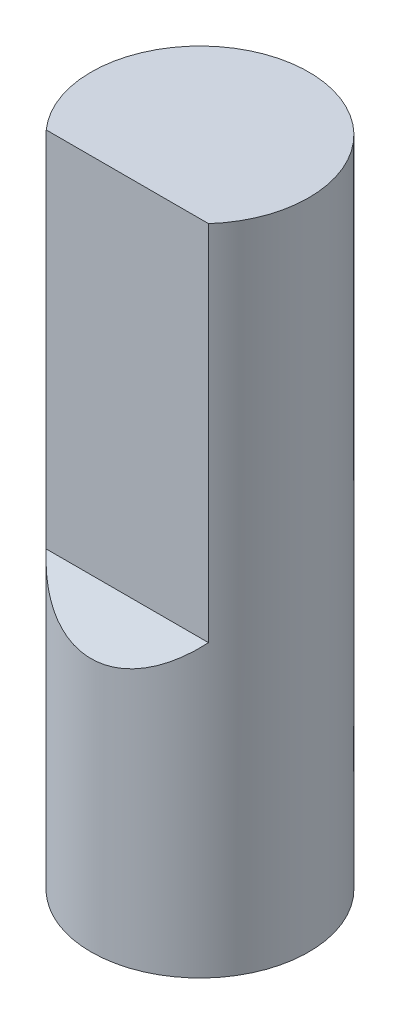
ISO-10303-21;
HEADER;
FILE_DESCRIPTION(('STEP AP214'),'2;1');
FILE_NAME('part.step','',(''),(''),'','','');
FILE_SCHEMA(('AUTOMOTIVE_DESIGN { 1 0 10303 214 1 1 1 1 }'));
ENDSEC;
DATA;
#1=APPLICATION_CONTEXT('core data for automotive mechanical design processes');
#2=APPLICATION_PROTOCOL_DEFINITION('international standard','automotive_design',2000,#1);
#3=PRODUCT_CONTEXT('',#1,'mechanical');
#4=PRODUCT('Part','Part','',(#3));
#5=PRODUCT_RELATED_PRODUCT_CATEGORY('part','',(#4));
#6=PRODUCT_DEFINITION_FORMATION('','',#4);
#7=PRODUCT_DEFINITION_CONTEXT('part definition',#1,'design');
#8=PRODUCT_DEFINITION('design','',#6,#7);
#9=PRODUCT_DEFINITION_SHAPE('','',#8);
#10=(LENGTH_UNIT() NAMED_UNIT(*) SI_UNIT(.MILLI.,.METRE.));
#11=(NAMED_UNIT(*) PLANE_ANGLE_UNIT() SI_UNIT($,.RADIAN.));
#12=(NAMED_UNIT(*) SI_UNIT($,.STERADIAN.) SOLID_ANGLE_UNIT());
#13=UNCERTAINTY_MEASURE_WITH_UNIT(LENGTH_MEASURE(1.E-05),#10,'distance_accuracy_value','');
#14=(GEOMETRIC_REPRESENTATION_CONTEXT(3) GLOBAL_UNCERTAINTY_ASSIGNED_CONTEXT((#13)) GLOBAL_UNIT_ASSIGNED_CONTEXT((#10,
#11,#12)) REPRESENTATION_CONTEXT('',''));
#15=CARTESIAN_POINT('',(0.,0.,0.));
#16=DIRECTION('',(0.,0.,1.));
#17=DIRECTION('',(1.,0.,0.));
#18=AXIS2_PLACEMENT_3D('',#15,#16,#17);
#19=CARTESIAN_POINT('',(0.,18.,0.));
#20=DIRECTION('',(0.,-1.,0.));
#21=DIRECTION('',(0.,0.,-1.));
#22=AXIS2_PLACEMENT_3D('',#19,#20,#21);
#23=CYLINDRICAL_SURFACE('',#22,3.);
#24=CARTESIAN_POINT('',(0.,10.,0.));
#25=DIRECTION('',(0.,-0.707106781186547,-0.707106781186548));
#26=DIRECTION('',(0.,-0.707106781186548,0.707106781186547));
#27=AXIS2_PLACEMENT_3D('',#24,#25,#26);
#28=ELLIPSE('',#27,4.24264068711929,3.);
#29=CARTESIAN_POINT('',(2.23606797749979,8.,2.));
#30=VERTEX_POINT('',#29);
#31=CARTESIAN_POINT('',(-2.23606797749979,8.,2.));
#32=VERTEX_POINT('',#31);
#33=EDGE_CURVE('E66',#30,#32,#28,.T.);
#34=ORIENTED_EDGE('',*,*,#33,.T.);
#35=DIRECTION('',(0.,1.,0.));
#36=VECTOR('',#35,1.);
#37=CARTESIAN_POINT('',(-2.23606797749979,8.,2.));
#38=LINE('',#37,#36);
#39=CARTESIAN_POINT('',(-2.23606797749979,18.,2.));
#40=VERTEX_POINT('',#39);
#41=EDGE_CURVE('E74',#32,#40,#38,.T.);
#42=ORIENTED_EDGE('',*,*,#41,.T.);
#43=CARTESIAN_POINT('',(0.,18.,0.));
#44=DIRECTION('',(0.,1.,0.));
#45=DIRECTION('',(0.,0.,1.));
#46=AXIS2_PLACEMENT_3D('',#43,#44,#45);
#47=CIRCLE('',#46,3.);
#48=CARTESIAN_POINT('',(2.23606797749979,18.,2.));
#49=VERTEX_POINT('',#48);
#50=EDGE_CURVE('E11',#49,#40,#47,.T.);
#51=ORIENTED_EDGE('',*,*,#50,.F.);
#52=DIRECTION('',(0.,1.,0.));
#53=VECTOR('',#52,1.);
#54=CARTESIAN_POINT('',(2.23606797749979,8.,2.));
#55=LINE('',#54,#53);
#56=EDGE_CURVE('E58',#30,#49,#55,.T.);
#57=ORIENTED_EDGE('',*,*,#56,.F.);
#58=EDGE_LOOP('',(#34,#42,#51,#57));
#59=FACE_BOUND('',#58,.T.);
#60=CARTESIAN_POINT('',(0.,0.,0.));
#61=DIRECTION('',(0.,1.,0.));
#62=DIRECTION('',(0.,0.,1.));
#63=AXIS2_PLACEMENT_3D('',#60,#61,#62);
#64=CIRCLE('',#63,3.);
#65=CARTESIAN_POINT('',(0.,0.,3.));
#66=VERTEX_POINT('',#65);
#67=EDGE_CURVE('E47',#66,#66,#64,.T.);
#68=ORIENTED_EDGE('',*,*,#67,.T.);
#69=EDGE_LOOP('',(#68));
#70=FACE_BOUND('',#69,.T.);
#71=ADVANCED_FACE('F44',(#59,#70),#23,.T.);
#72=CARTESIAN_POINT('',(0.,18.,0.));
#73=DIRECTION('',(0.,1.,0.));
#74=DIRECTION('',(0.,0.,1.));
#75=AXIS2_PLACEMENT_3D('',#72,#73,#74);
#76=PLANE('',#75);
#77=DIRECTION('',(-1.,0.,0.));
#78=VECTOR('',#77,1.);
#79=CARTESIAN_POINT('',(-2.23606797749979,18.,2.));
#80=LINE('',#79,#78);
#81=EDGE_CURVE('E75',#49,#40,#80,.T.);
#82=ORIENTED_EDGE('',*,*,#81,.F.);
#83=ORIENTED_EDGE('',*,*,#50,.T.);
#84=EDGE_LOOP('',(#82,#83));
#85=FACE_BOUND('',#84,.T.);
#86=ADVANCED_FACE('F89',(#85),#76,.T.);
#87=CARTESIAN_POINT('',(0.,0.,0.));
#88=DIRECTION('',(0.,1.,0.));
#89=DIRECTION('',(0.,0.,1.));
#90=AXIS2_PLACEMENT_3D('',#87,#88,#89);
#91=PLANE('',#90);
#92=ORIENTED_EDGE('',*,*,#67,.F.);
#93=EDGE_LOOP('',(#92));
#94=FACE_BOUND('',#93,.T.);
#95=ADVANCED_FACE('F87',(#94),#91,.F.);
#96=CARTESIAN_POINT('',(-2.23606797749979,8.,2.));
#97=DIRECTION('',(0.,0.,-1.));
#98=DIRECTION('',(-1.,0.,0.));
#99=AXIS2_PLACEMENT_3D('',#96,#97,#98);
#100=PLANE('',#99);
#101=ORIENTED_EDGE('',*,*,#81,.T.);
#102=ORIENTED_EDGE('',*,*,#41,.F.);
#103=DIRECTION('',(-1.,0.,0.));
#104=VECTOR('',#103,1.);
#105=CARTESIAN_POINT('',(-2.23606797749979,8.,2.));
#106=LINE('',#105,#104);
#107=EDGE_CURVE('E77',#30,#32,#106,.T.);
#108=ORIENTED_EDGE('',*,*,#107,.F.);
#109=ORIENTED_EDGE('',*,*,#56,.T.);
#110=EDGE_LOOP('',(#101,#102,#108,#109));
#111=FACE_BOUND('',#110,.T.);
#112=ADVANCED_FACE('F80',(#111),#100,.F.);
#113=CARTESIAN_POINT('',(-3.,8.,2.));
#114=DIRECTION('',(0.,-0.707106781186547,-0.707106781186548));
#115=DIRECTION('',(0.,0.707106781186548,-0.707106781186547));
#116=AXIS2_PLACEMENT_3D('',#113,#114,#115);
#117=PLANE('',#116);
#118=ORIENTED_EDGE('',*,*,#33,.F.);
#119=ORIENTED_EDGE('',*,*,#107,.T.);
#120=EDGE_LOOP('',(#118,#119));
#121=FACE_BOUND('',#120,.T.);
#122=ADVANCED_FACE('F78',(#121),#117,.F.);
#123=CLOSED_SHELL('',(#71,#86,#95,#112,#122));
#124=MANIFOLD_SOLID_BREP('B2',#123);
#125=ADVANCED_BREP_SHAPE_REPRESENTATION('',(#18,#124),#14);
#126=SHAPE_DEFINITION_REPRESENTATION(#9,#125);
ENDSEC;
END-ISO-10303-21;
